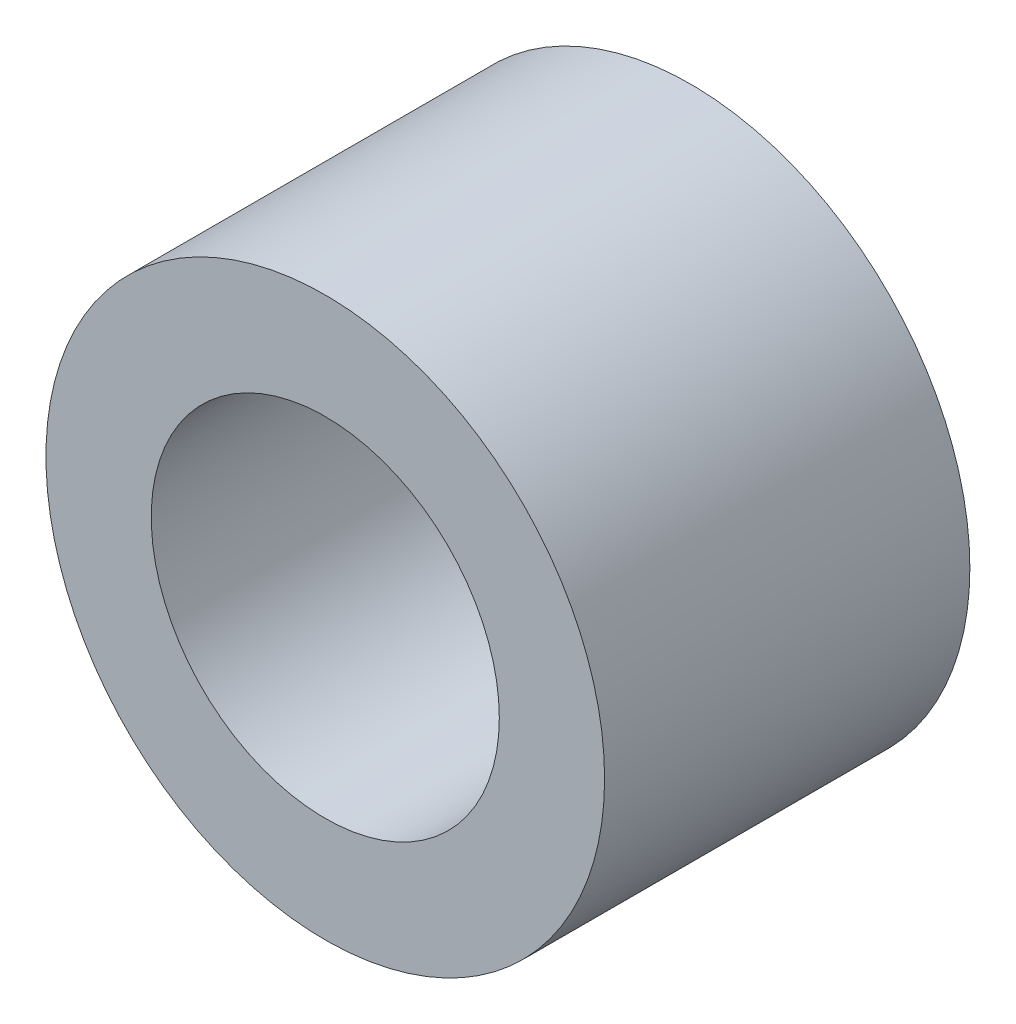
ISO-10303-21;
HEADER;
FILE_DESCRIPTION(('STEP AP214'),'2;1');
FILE_NAME('part.step','',(''),(''),'','','');
FILE_SCHEMA(('AUTOMOTIVE_DESIGN { 1 0 10303 214 1 1 1 1 }'));
ENDSEC;
DATA;
#1=APPLICATION_CONTEXT('core data for automotive mechanical design processes');
#2=APPLICATION_PROTOCOL_DEFINITION('international standard','automotive_design',2000,#1);
#3=PRODUCT_CONTEXT('',#1,'mechanical');
#4=PRODUCT('Part','Part','',(#3));
#5=PRODUCT_RELATED_PRODUCT_CATEGORY('part','',(#4));
#6=PRODUCT_DEFINITION_FORMATION('','',#4);
#7=PRODUCT_DEFINITION_CONTEXT('part definition',#1,'design');
#8=PRODUCT_DEFINITION('design','',#6,#7);
#9=PRODUCT_DEFINITION_SHAPE('','',#8);
#10=(LENGTH_UNIT() NAMED_UNIT(*) SI_UNIT(.MILLI.,.METRE.));
#11=(NAMED_UNIT(*) PLANE_ANGLE_UNIT() SI_UNIT($,.RADIAN.));
#12=(NAMED_UNIT(*) SI_UNIT($,.STERADIAN.) SOLID_ANGLE_UNIT());
#13=UNCERTAINTY_MEASURE_WITH_UNIT(LENGTH_MEASURE(1.E-05),#10,'distance_accuracy_value','');
#14=(GEOMETRIC_REPRESENTATION_CONTEXT(3) GLOBAL_UNCERTAINTY_ASSIGNED_CONTEXT((#13)) GLOBAL_UNIT_ASSIGNED_CONTEXT((#10,
#11,#12)) REPRESENTATION_CONTEXT('',''));
#15=CARTESIAN_POINT('',(0.,0.,0.));
#16=DIRECTION('',(0.,0.,1.));
#17=DIRECTION('',(1.,0.,0.));
#18=AXIS2_PLACEMENT_3D('',#15,#16,#17);
#19=CARTESIAN_POINT('',(0.,0.,4.25));
#20=DIRECTION('',(0.,0.,1.));
#21=DIRECTION('',(1.,0.,0.));
#22=AXIS2_PLACEMENT_3D('',#19,#20,#21);
#23=PLANE('',#22);
#24=CARTESIAN_POINT('',(0.,0.,4.25));
#25=DIRECTION('',(0.,0.,1.));
#26=DIRECTION('',(1.,0.,0.));
#27=AXIS2_PLACEMENT_3D('',#24,#25,#26);
#28=CIRCLE('',#27,6.5);
#29=CARTESIAN_POINT('',(6.5,0.,4.25));
#30=VERTEX_POINT('',#29);
#31=EDGE_CURVE('E10',#30,#30,#28,.T.);
#32=ORIENTED_EDGE('',*,*,#31,.T.);
#33=EDGE_LOOP('',(#32));
#34=FACE_BOUND('',#33,.T.);
#35=CARTESIAN_POINT('',(0.,0.,4.25));
#36=DIRECTION('',(0.,0.,1.));
#37=DIRECTION('',(1.,0.,0.));
#38=AXIS2_PLACEMENT_3D('',#35,#36,#37);
#39=CIRCLE('',#38,4.05);
#40=CARTESIAN_POINT('',(4.05,0.,4.25));
#41=VERTEX_POINT('',#40);
#42=EDGE_CURVE('E41',#41,#41,#39,.T.);
#43=ORIENTED_EDGE('',*,*,#42,.F.);
#44=EDGE_LOOP('',(#43));
#45=FACE_BOUND('',#44,.T.);
#46=ADVANCED_FACE('F30',(#34,#45),#23,.T.);
#47=CARTESIAN_POINT('',(0.,0.,-4.25));
#48=DIRECTION('',(0.,0.,1.));
#49=DIRECTION('',(1.,0.,0.));
#50=AXIS2_PLACEMENT_3D('',#47,#48,#49);
#51=PLANE('',#50);
#52=CARTESIAN_POINT('',(0.,0.,-4.25));
#53=DIRECTION('',(0.,0.,1.));
#54=DIRECTION('',(1.,0.,0.));
#55=AXIS2_PLACEMENT_3D('',#52,#53,#54);
#56=CIRCLE('',#55,6.5);
#57=CARTESIAN_POINT('',(6.5,0.,-4.25));
#58=VERTEX_POINT('',#57);
#59=EDGE_CURVE('E34',#58,#58,#56,.T.);
#60=ORIENTED_EDGE('',*,*,#59,.F.);
#61=EDGE_LOOP('',(#60));
#62=FACE_BOUND('',#61,.T.);
#63=CARTESIAN_POINT('',(0.,0.,-4.25));
#64=DIRECTION('',(0.,0.,1.));
#65=DIRECTION('',(1.,0.,0.));
#66=AXIS2_PLACEMENT_3D('',#63,#64,#65);
#67=CIRCLE('',#66,4.05);
#68=CARTESIAN_POINT('',(4.05,0.,-4.25));
#69=VERTEX_POINT('',#68);
#70=EDGE_CURVE('E43',#69,#69,#67,.T.);
#71=ORIENTED_EDGE('',*,*,#70,.T.);
#72=EDGE_LOOP('',(#71));
#73=FACE_BOUND('',#72,.T.);
#74=ADVANCED_FACE('F53',(#62,#73),#51,.F.);
#75=CARTESIAN_POINT('',(0.,0.,4.25));
#76=DIRECTION('',(0.,0.,-1.));
#77=DIRECTION('',(-1.,0.,0.));
#78=AXIS2_PLACEMENT_3D('',#75,#76,#77);
#79=CYLINDRICAL_SURFACE('',#78,6.5);
#80=ORIENTED_EDGE('',*,*,#31,.F.);
#81=EDGE_LOOP('',(#80));
#82=FACE_BOUND('',#81,.T.);
#83=ORIENTED_EDGE('',*,*,#59,.T.);
#84=EDGE_LOOP('',(#83));
#85=FACE_BOUND('',#84,.T.);
#86=ADVANCED_FACE('F32',(#82,#85),#79,.T.);
#87=CARTESIAN_POINT('',(0.,0.,4.25));
#88=DIRECTION('',(0.,0.,-1.));
#89=DIRECTION('',(-1.,0.,0.));
#90=AXIS2_PLACEMENT_3D('',#87,#88,#89);
#91=CYLINDRICAL_SURFACE('',#90,4.05);
#92=ORIENTED_EDGE('',*,*,#42,.T.);
#93=EDGE_LOOP('',(#92));
#94=FACE_BOUND('',#93,.T.);
#95=ORIENTED_EDGE('',*,*,#70,.F.);
#96=EDGE_LOOP('',(#95));
#97=FACE_BOUND('',#96,.T.);
#98=ADVANCED_FACE('F49',(#94,#97),#91,.F.);
#99=CLOSED_SHELL('',(#46,#74,#86,#98));
#100=MANIFOLD_SOLID_BREP('B2',#99);
#101=ADVANCED_BREP_SHAPE_REPRESENTATION('',(#18,#100),#14);
#102=SHAPE_DEFINITION_REPRESENTATION(#9,#101);
ENDSEC;
END-ISO-10303-21;
